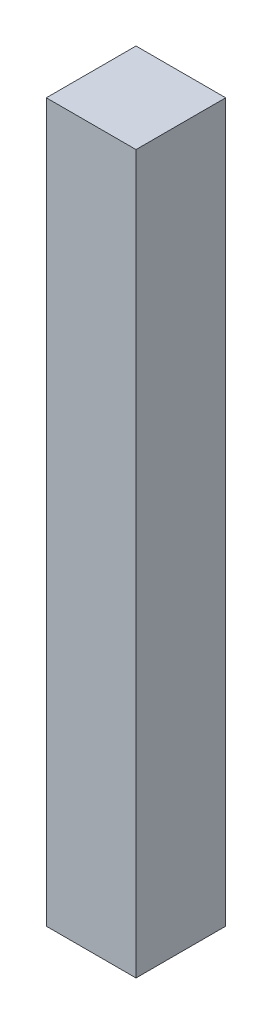
ISO-10303-21;
HEADER;
FILE_DESCRIPTION(('STEP AP214'),'2;1');
FILE_NAME('part.step','',(''),(''),'','','');
FILE_SCHEMA(('AUTOMOTIVE_DESIGN { 1 0 10303 214 1 1 1 1 }'));
ENDSEC;
DATA;
#1=APPLICATION_CONTEXT('core data for automotive mechanical design processes');
#2=APPLICATION_PROTOCOL_DEFINITION('international standard','automotive_design',2000,#1);
#3=PRODUCT_CONTEXT('',#1,'mechanical');
#4=PRODUCT('Part','Part','',(#3));
#5=PRODUCT_RELATED_PRODUCT_CATEGORY('part','',(#4));
#6=PRODUCT_DEFINITION_FORMATION('','',#4);
#7=PRODUCT_DEFINITION_CONTEXT('part definition',#1,'design');
#8=PRODUCT_DEFINITION('design','',#6,#7);
#9=PRODUCT_DEFINITION_SHAPE('','',#8);
#10=(LENGTH_UNIT() NAMED_UNIT(*) SI_UNIT(.MILLI.,.METRE.));
#11=(NAMED_UNIT(*) PLANE_ANGLE_UNIT() SI_UNIT($,.RADIAN.));
#12=(NAMED_UNIT(*) SI_UNIT($,.STERADIAN.) SOLID_ANGLE_UNIT());
#13=UNCERTAINTY_MEASURE_WITH_UNIT(LENGTH_MEASURE(1.E-05),#10,'distance_accuracy_value','');
#14=(GEOMETRIC_REPRESENTATION_CONTEXT(3) GLOBAL_UNCERTAINTY_ASSIGNED_CONTEXT((#13)) GLOBAL_UNIT_ASSIGNED_CONTEXT((#10,
#11,#12)) REPRESENTATION_CONTEXT('',''));
#15=CARTESIAN_POINT('',(0.,0.,0.));
#16=DIRECTION('',(0.,0.,1.));
#17=DIRECTION('',(1.,0.,0.));
#18=AXIS2_PLACEMENT_3D('',#15,#16,#17);
#19=CARTESIAN_POINT('',(25.4,406.4,25.4));
#20=DIRECTION('',(-1.,0.,0.));
#21=DIRECTION('',(0.,0.,1.));
#22=AXIS2_PLACEMENT_3D('',#19,#20,#21);
#23=PLANE('',#22);
#24=DIRECTION('',(0.,0.,-1.));
#25=VECTOR('',#24,1.);
#26=CARTESIAN_POINT('',(25.4,0.,25.4));
#27=LINE('',#26,#25);
#28=CARTESIAN_POINT('',(25.4,0.,25.4));
#29=VERTEX_POINT('',#28);
#30=CARTESIAN_POINT('',(25.4,0.,-25.4));
#31=VERTEX_POINT('',#30);
#32=EDGE_CURVE('E111',#29,#31,#27,.T.);
#33=ORIENTED_EDGE('',*,*,#32,.T.);
#34=DIRECTION('',(0.,-1.,0.));
#35=VECTOR('',#34,1.);
#36=CARTESIAN_POINT('',(25.4,406.4,-25.4));
#37=LINE('',#36,#35);
#38=CARTESIAN_POINT('',(25.4,406.4,-25.4));
#39=VERTEX_POINT('',#38);
#40=EDGE_CURVE('E11',#39,#31,#37,.T.);
#41=ORIENTED_EDGE('',*,*,#40,.F.);
#42=DIRECTION('',(0.,0.,-1.));
#43=VECTOR('',#42,1.);
#44=CARTESIAN_POINT('',(25.4,406.4,25.4));
#45=LINE('',#44,#43);
#46=CARTESIAN_POINT('',(25.4,406.4,25.4));
#47=VERTEX_POINT('',#46);
#48=EDGE_CURVE('E95',#47,#39,#45,.T.);
#49=ORIENTED_EDGE('',*,*,#48,.F.);
#50=DIRECTION('',(0.,-1.,0.));
#51=VECTOR('',#50,1.);
#52=CARTESIAN_POINT('',(25.4,406.4,25.4));
#53=LINE('',#52,#51);
#54=EDGE_CURVE('E107',#47,#29,#53,.T.);
#55=ORIENTED_EDGE('',*,*,#54,.T.);
#56=EDGE_LOOP('',(#33,#41,#49,#55));
#57=FACE_BOUND('',#56,.T.);
#58=ADVANCED_FACE('F43',(#57),#23,.F.);
#59=CARTESIAN_POINT('',(-25.4,406.4,-25.4));
#60=DIRECTION('',(0.,0.,1.));
#61=DIRECTION('',(1.,0.,0.));
#62=AXIS2_PLACEMENT_3D('',#59,#60,#61);
#63=PLANE('',#62);
#64=DIRECTION('',(-1.,0.,0.));
#65=VECTOR('',#64,1.);
#66=CARTESIAN_POINT('',(-25.4,0.,-25.4));
#67=LINE('',#66,#65);
#68=CARTESIAN_POINT('',(-25.4,0.,-25.4));
#69=VERTEX_POINT('',#68);
#70=EDGE_CURVE('E100',#31,#69,#67,.T.);
#71=ORIENTED_EDGE('',*,*,#70,.T.);
#72=DIRECTION('',(0.,-1.,0.));
#73=VECTOR('',#72,1.);
#74=CARTESIAN_POINT('',(-25.4,406.4,-25.4));
#75=LINE('',#74,#73);
#76=CARTESIAN_POINT('',(-25.4,406.4,-25.4));
#77=VERTEX_POINT('',#76);
#78=EDGE_CURVE('E52',#77,#69,#75,.T.);
#79=ORIENTED_EDGE('',*,*,#78,.F.);
#80=DIRECTION('',(-1.,0.,0.));
#81=VECTOR('',#80,1.);
#82=CARTESIAN_POINT('',(-25.4,406.4,-25.4));
#83=LINE('',#82,#81);
#84=EDGE_CURVE('E90',#39,#77,#83,.T.);
#85=ORIENTED_EDGE('',*,*,#84,.F.);
#86=ORIENTED_EDGE('',*,*,#40,.T.);
#87=EDGE_LOOP('',(#71,#79,#85,#86));
#88=FACE_BOUND('',#87,.T.);
#89=ADVANCED_FACE('F99',(#88),#63,.F.);
#90=CARTESIAN_POINT('',(-25.4,406.4,25.4));
#91=DIRECTION('',(1.,0.,0.));
#92=DIRECTION('',(0.,0.,-1.));
#93=AXIS2_PLACEMENT_3D('',#90,#91,#92);
#94=PLANE('',#93);
#95=DIRECTION('',(0.,0.,1.));
#96=VECTOR('',#95,1.);
#97=CARTESIAN_POINT('',(-25.4,0.,25.4));
#98=LINE('',#97,#96);
#99=CARTESIAN_POINT('',(-25.4,0.,25.4));
#100=VERTEX_POINT('',#99);
#101=EDGE_CURVE('E77',#69,#100,#98,.T.);
#102=ORIENTED_EDGE('',*,*,#101,.T.);
#103=DIRECTION('',(0.,-1.,0.));
#104=VECTOR('',#103,1.);
#105=CARTESIAN_POINT('',(-25.4,406.4,25.4));
#106=LINE('',#105,#104);
#107=CARTESIAN_POINT('',(-25.4,406.4,25.4));
#108=VERTEX_POINT('',#107);
#109=EDGE_CURVE('E102',#108,#100,#106,.T.);
#110=ORIENTED_EDGE('',*,*,#109,.F.);
#111=DIRECTION('',(0.,0.,1.));
#112=VECTOR('',#111,1.);
#113=CARTESIAN_POINT('',(-25.4,406.4,25.4));
#114=LINE('',#113,#112);
#115=EDGE_CURVE('E93',#77,#108,#114,.T.);
#116=ORIENTED_EDGE('',*,*,#115,.F.);
#117=ORIENTED_EDGE('',*,*,#78,.T.);
#118=EDGE_LOOP('',(#102,#110,#116,#117));
#119=FACE_BOUND('',#118,.T.);
#120=ADVANCED_FACE('F103',(#119),#94,.F.);
#121=CARTESIAN_POINT('',(-25.4,406.4,25.4));
#122=DIRECTION('',(0.,0.,-1.));
#123=DIRECTION('',(-1.,0.,0.));
#124=AXIS2_PLACEMENT_3D('',#121,#122,#123);
#125=PLANE('',#124);
#126=DIRECTION('',(1.,0.,0.));
#127=VECTOR('',#126,1.);
#128=CARTESIAN_POINT('',(-25.4,0.,25.4));
#129=LINE('',#128,#127);
#130=EDGE_CURVE('E83',#100,#29,#129,.T.);
#131=ORIENTED_EDGE('',*,*,#130,.T.);
#132=ORIENTED_EDGE('',*,*,#54,.F.);
#133=DIRECTION('',(1.,0.,0.));
#134=VECTOR('',#133,1.);
#135=CARTESIAN_POINT('',(-25.4,406.4,25.4));
#136=LINE('',#135,#134);
#137=EDGE_CURVE('E60',#108,#47,#136,.T.);
#138=ORIENTED_EDGE('',*,*,#137,.F.);
#139=ORIENTED_EDGE('',*,*,#109,.T.);
#140=EDGE_LOOP('',(#131,#132,#138,#139));
#141=FACE_BOUND('',#140,.T.);
#142=ADVANCED_FACE('F124',(#141),#125,.F.);
#143=CARTESIAN_POINT('',(0.,406.4,0.));
#144=DIRECTION('',(0.,-1.,0.));
#145=DIRECTION('',(0.,0.,-1.));
#146=AXIS2_PLACEMENT_3D('',#143,#144,#145);
#147=PLANE('',#146);
#148=ORIENTED_EDGE('',*,*,#48,.T.);
#149=ORIENTED_EDGE('',*,*,#84,.T.);
#150=ORIENTED_EDGE('',*,*,#115,.T.);
#151=ORIENTED_EDGE('',*,*,#137,.T.);
#152=EDGE_LOOP('',(#148,#149,#150,#151));
#153=FACE_BOUND('',#152,.T.);
#154=ADVANCED_FACE('F91',(#153),#147,.F.);
#155=CARTESIAN_POINT('',(0.,0.,0.));
#156=DIRECTION('',(0.,-1.,0.));
#157=DIRECTION('',(0.,0.,-1.));
#158=AXIS2_PLACEMENT_3D('',#155,#156,#157);
#159=PLANE('',#158);
#160=ORIENTED_EDGE('',*,*,#32,.F.);
#161=ORIENTED_EDGE('',*,*,#130,.F.);
#162=ORIENTED_EDGE('',*,*,#101,.F.);
#163=ORIENTED_EDGE('',*,*,#70,.F.);
#164=EDGE_LOOP('',(#160,#161,#162,#163));
#165=FACE_BOUND('',#164,.T.);
#166=ADVANCED_FACE('F127',(#165),#159,.T.);
#167=CLOSED_SHELL('',(#58,#89,#120,#142,#154,#166));
#168=MANIFOLD_SOLID_BREP('B2',#167);
#169=ADVANCED_BREP_SHAPE_REPRESENTATION('',(#18,#168),#14);
#170=SHAPE_DEFINITION_REPRESENTATION(#9,#169);
ENDSEC;
END-ISO-10303-21;
